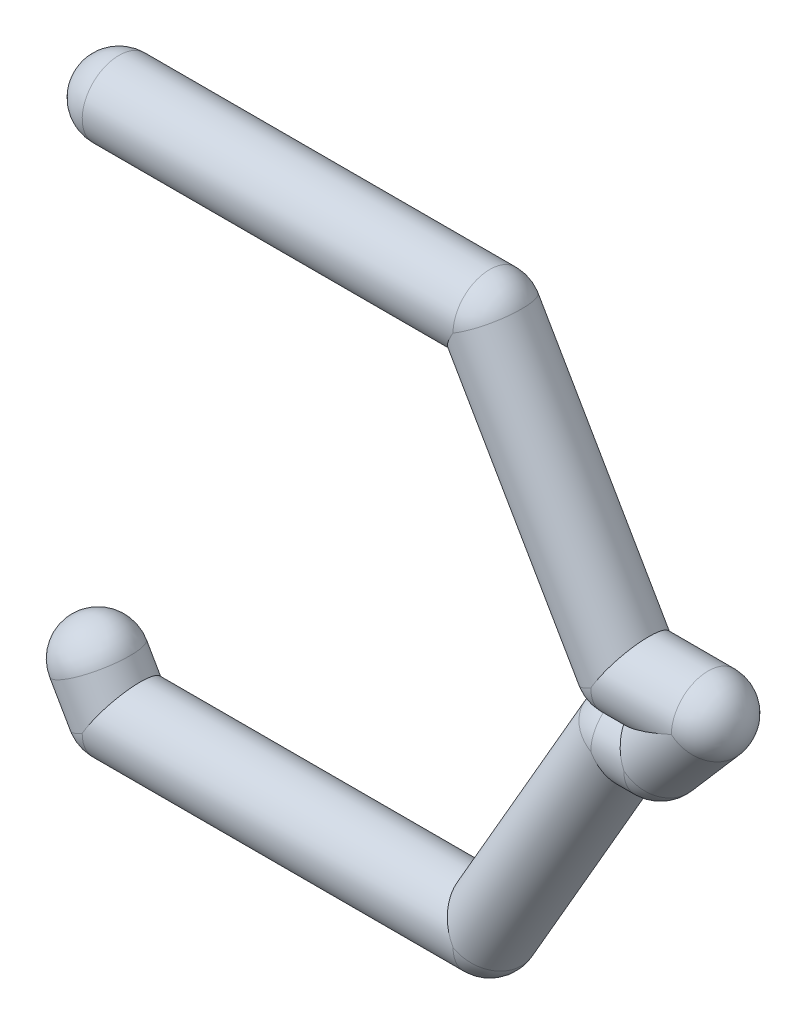
ISO-10303-21;
HEADER;
FILE_DESCRIPTION(('STEP AP214'),'2;1');
FILE_NAME('part.step','',(''),(''),'','','');
FILE_SCHEMA(('AUTOMOTIVE_DESIGN { 1 0 10303 214 1 1 1 1 }'));
ENDSEC;
DATA;
#1=APPLICATION_CONTEXT('core data for automotive mechanical design processes');
#2=APPLICATION_PROTOCOL_DEFINITION('international standard','automotive_design',2000,#1);
#3=PRODUCT_CONTEXT('',#1,'mechanical');
#4=PRODUCT('Part','Part','',(#3));
#5=PRODUCT_RELATED_PRODUCT_CATEGORY('part','',(#4));
#6=PRODUCT_DEFINITION_FORMATION('','',#4);
#7=PRODUCT_DEFINITION_CONTEXT('part definition',#1,'design');
#8=PRODUCT_DEFINITION('design','',#6,#7);
#9=PRODUCT_DEFINITION_SHAPE('','',#8);
#10=(LENGTH_UNIT() NAMED_UNIT(*) SI_UNIT(.MILLI.,.METRE.));
#11=(NAMED_UNIT(*) PLANE_ANGLE_UNIT() SI_UNIT($,.RADIAN.));
#12=(NAMED_UNIT(*) SI_UNIT($,.STERADIAN.) SOLID_ANGLE_UNIT());
#13=UNCERTAINTY_MEASURE_WITH_UNIT(LENGTH_MEASURE(1.E-05),#10,'distance_accuracy_value','');
#14=(GEOMETRIC_REPRESENTATION_CONTEXT(3) GLOBAL_UNCERTAINTY_ASSIGNED_CONTEXT((#13)) GLOBAL_UNIT_ASSIGNED_CONTEXT((#10,
#11,#12)) REPRESENTATION_CONTEXT('',''));
#15=CARTESIAN_POINT('',(0.,0.,0.));
#16=DIRECTION('',(0.,0.,1.));
#17=DIRECTION('',(1.,0.,0.));
#18=AXIS2_PLACEMENT_3D('',#15,#16,#17);
#19=CARTESIAN_POINT('',(-14.515,-13.08,1.125));
#20=DIRECTION('',(1.,0.,0.));
#21=DIRECTION('',(0.,-1.,0.));
#22=AXIS2_PLACEMENT_3D('',#19,#20,#21);
#23=SPHERICAL_SURFACE('',#22,0.24);
#24=CARTESIAN_POINT('',(-14.515,-13.08,1.125));
#25=DIRECTION('',(-0.499298623879163,0.866429964966802,0.));
#26=DIRECTION('',(-0.866429964966802,-0.499298623879163,0.));
#27=AXIS2_PLACEMENT_3D('',#24,#25,#26);
#28=CIRCLE('',#27,0.24);
#29=CARTESIAN_POINT('',(-14.515,-13.08,0.885));
#30=VERTEX_POINT('',#29);
#31=CARTESIAN_POINT('',(-14.515,-13.08,1.365));
#32=VERTEX_POINT('',#31);
#33=EDGE_CURVE('E150',#30,#32,#28,.T.);
#34=ORIENTED_EDGE('',*,*,#33,.F.);
#35=CARTESIAN_POINT('',(-14.515,-13.08,1.125));
#36=DIRECTION('',(-1.,0.,0.));
#37=DIRECTION('',(0.,0.,1.));
#38=AXIS2_PLACEMENT_3D('',#35,#36,#37);
#39=CIRCLE('',#38,0.24);
#40=EDGE_CURVE('E151',#32,#30,#39,.F.);
#41=ORIENTED_EDGE('',*,*,#40,.F.);
#42=EDGE_LOOP('',(#34,#41));
#43=FACE_BOUND('',#42,.T.);
#44=ADVANCED_FACE('F81',(#43),#23,.T.);
#45=CARTESIAN_POINT('',(-12.09,-13.08,1.125));
#46=DIRECTION('',(-1.,0.,0.));
#47=DIRECTION('',(0.,0.,1.));
#48=AXIS2_PLACEMENT_3D('',#45,#46,#47);
#49=CYLINDRICAL_SURFACE('',#48,0.24);
#50=CARTESIAN_POINT('',(-14.515,-13.08,1.125));
#51=DIRECTION('',(-0.865822910264902,0.500350565164481,0.));
#52=DIRECTION('',(-0.500350565164481,-0.865822910264902,0.));
#53=AXIS2_PLACEMENT_3D('',#50,#51,#52);
#54=ELLIPSE('',#53,0.277192942291826,0.24);
#55=EDGE_CURVE('E94',#32,#30,#54,.T.);
#56=ORIENTED_EDGE('',*,*,#55,.F.);
#57=ORIENTED_EDGE('',*,*,#40,.T.);
#58=EDGE_LOOP('',(#56,#57));
#59=FACE_BOUND('',#58,.T.);
#60=CARTESIAN_POINT('',(-12.09,-13.08,1.125));
#61=DIRECTION('',(-0.866065491045954,-0.499930560397472,0.));
#62=DIRECTION('',(-0.499930560397472,0.866065491045954,0.));
#63=AXIS2_PLACEMENT_3D('',#60,#61,#62);
#64=ELLIPSE('',#63,0.277115301881097,0.24);
#65=CARTESIAN_POINT('',(-12.09,-13.08,0.885));
#66=VERTEX_POINT('',#65);
#67=CARTESIAN_POINT('',(-12.09,-13.08,1.365));
#68=VERTEX_POINT('',#67);
#69=EDGE_CURVE('E88',#66,#68,#64,.F.);
#70=ORIENTED_EDGE('',*,*,#69,.F.);
#71=CARTESIAN_POINT('',(-12.09,-13.08,1.125));
#72=DIRECTION('',(-1.,0.,0.));
#73=DIRECTION('',(0.,0.,1.));
#74=AXIS2_PLACEMENT_3D('',#71,#72,#73);
#75=CIRCLE('',#74,0.24);
#76=EDGE_CURVE('E155',#66,#68,#75,.T.);
#77=ORIENTED_EDGE('',*,*,#76,.T.);
#78=EDGE_LOOP('',(#70,#77));
#79=FACE_BOUND('',#78,.T.);
#80=ADVANCED_FACE('F154',(#59,#79),#49,.T.);
#81=CARTESIAN_POINT('',(-12.09,-13.08,1.125));
#82=DIRECTION('',(1.,0.,0.));
#83=DIRECTION('',(0.,-1.,0.));
#84=AXIS2_PLACEMENT_3D('',#81,#82,#83);
#85=SPHERICAL_SURFACE('',#84,0.24);
#86=ORIENTED_EDGE('',*,*,#76,.F.);
#87=CARTESIAN_POINT('',(-12.09,-13.08,1.125));
#88=DIRECTION('',(-0.500138869561338,-0.865945212559032,0.));
#89=DIRECTION('',(0.865945212559032,-0.500138869561338,0.));
#90=AXIS2_PLACEMENT_3D('',#87,#88,#89);
#91=CIRCLE('',#90,0.24);
#92=EDGE_CURVE('E214',#68,#66,#91,.F.);
#93=ORIENTED_EDGE('',*,*,#92,.F.);
#94=EDGE_LOOP('',(#86,#93));
#95=FACE_BOUND('',#94,.T.);
#96=ADVANCED_FACE('F224',(#95),#85,.T.);
#97=CARTESIAN_POINT('',(-11.189,-11.52,1.125));
#98=DIRECTION('',(-0.500138869561338,-0.865945212559032,0.));
#99=DIRECTION('',(0.865945212559032,-0.500138869561338,0.));
#100=AXIS2_PLACEMENT_3D('',#97,#98,#99);
#101=CYLINDRICAL_SURFACE('',#100,0.240000000000001);
#102=CARTESIAN_POINT('',(-11.189,-11.52,1.125));
#103=DIRECTION('',(-0.866065491045954,-0.499930560397472,0.));
#104=DIRECTION('',(0.499930560397472,-0.866065491045954,0.));
#105=AXIS2_PLACEMENT_3D('',#102,#103,#104);
#106=ELLIPSE('',#105,0.277115301881097,0.24);
#107=CARTESIAN_POINT('',(-11.189,-11.52,1.365));
#108=VERTEX_POINT('',#107);
#109=CARTESIAN_POINT('',(-11.189,-11.52,0.885));
#110=VERTEX_POINT('',#109);
#111=EDGE_CURVE('E217',#108,#110,#106,.F.);
#112=ORIENTED_EDGE('',*,*,#111,.F.);
#113=CARTESIAN_POINT('',(-11.189,-11.52,1.125));
#114=DIRECTION('',(-0.500138869561336,-0.865945212559033,0.));
#115=DIRECTION('',(0.865945212559033,-0.500138869561336,0.));
#116=AXIS2_PLACEMENT_3D('',#113,#114,#115);
#117=CIRCLE('',#116,0.240000000000001);
#118=EDGE_CURVE('E212',#108,#110,#117,.T.);
#119=ORIENTED_EDGE('',*,*,#118,.T.);
#120=EDGE_LOOP('',(#112,#119));
#121=FACE_BOUND('',#120,.T.);
#122=ORIENTED_EDGE('',*,*,#92,.T.);
#123=ORIENTED_EDGE('',*,*,#69,.T.);
#124=EDGE_LOOP('',(#122,#123));
#125=FACE_BOUND('',#124,.T.);
#126=ADVANCED_FACE('F222',(#121,#125),#101,.T.);
#127=CARTESIAN_POINT('',(-11.189,-11.52,1.125));
#128=DIRECTION('',(1.,0.,0.));
#129=DIRECTION('',(0.,-1.,0.));
#130=AXIS2_PLACEMENT_3D('',#127,#128,#129);
#131=SPHERICAL_SURFACE('',#130,0.24);
#132=ORIENTED_EDGE('',*,*,#118,.F.);
#133=CARTESIAN_POINT('',(-11.189,-11.52,1.125));
#134=DIRECTION('',(-1.,0.,0.));
#135=DIRECTION('',(0.,0.,1.));
#136=AXIS2_PLACEMENT_3D('',#133,#134,#135);
#137=CIRCLE('',#136,0.24);
#138=CARTESIAN_POINT('',(-11.189,-11.34,1.28374507866388));
#139=VERTEX_POINT('',#138);
#140=EDGE_CURVE('E161',#108,#139,#137,.T.);
#141=ORIENTED_EDGE('',*,*,#140,.T.);
#142=CARTESIAN_POINT('',(-11.189,-11.34,1.125));
#143=DIRECTION('',(0.,-1.,0.));
#144=DIRECTION('',(0.,0.,-1.));
#145=AXIS2_PLACEMENT_3D('',#142,#143,#144);
#146=CIRCLE('',#145,0.158745078663876);
#147=CARTESIAN_POINT('',(-11.189,-11.34,0.966254921336124));
#148=VERTEX_POINT('',#147);
#149=EDGE_CURVE('E187',#139,#148,#146,.T.);
#150=ORIENTED_EDGE('',*,*,#149,.T.);
#151=EDGE_CURVE('E164',#148,#110,#137,.T.);
#152=ORIENTED_EDGE('',*,*,#151,.T.);
#153=EDGE_LOOP('',(#132,#141,#150,#152));
#154=FACE_BOUND('',#153,.T.);
#155=ADVANCED_FACE('F238',(#154),#131,.T.);
#156=CARTESIAN_POINT('',(-10.973,-11.52,1.125));
#157=DIRECTION('',(1.,0.,0.));
#158=DIRECTION('',(0.,-1.,0.));
#159=AXIS2_PLACEMENT_3D('',#156,#157,#158);
#160=SPHERICAL_SURFACE('',#159,0.24);
#161=CARTESIAN_POINT('',(-10.973,-11.52,1.125));
#162=DIRECTION('',(-0.65372931799024,-0.756728470985475,0.));
#163=DIRECTION('',(0.756728470985475,-0.65372931799024,0.));
#164=AXIS2_PLACEMENT_3D('',#161,#162,#163);
#165=CIRCLE('',#164,0.240000000000001);
#166=CARTESIAN_POINT('',(-10.973,-11.52,0.885));
#167=VERTEX_POINT('',#166);
#168=CARTESIAN_POINT('',(-10.973,-11.52,1.365));
#169=VERTEX_POINT('',#168);
#170=EDGE_CURVE('E176',#167,#169,#165,.T.);
#171=ORIENTED_EDGE('',*,*,#170,.T.);
#172=CARTESIAN_POINT('',(-10.973,-11.52,1.125));
#173=DIRECTION('',(-1.,0.,0.));
#174=DIRECTION('',(0.,0.,1.));
#175=AXIS2_PLACEMENT_3D('',#172,#173,#174);
#176=CIRCLE('',#175,0.24);
#177=EDGE_CURVE('E158',#167,#169,#176,.T.);
#178=ORIENTED_EDGE('',*,*,#177,.F.);
#179=EDGE_LOOP('',(#171,#178));
#180=FACE_BOUND('',#179,.T.);
#181=ADVANCED_FACE('F244',(#180),#160,.T.);
#182=CARTESIAN_POINT('',(-10.662,-11.16,1.125));
#183=DIRECTION('',(1.,0.,0.));
#184=DIRECTION('',(0.,-1.,0.));
#185=AXIS2_PLACEMENT_3D('',#182,#183,#184);
#186=SPHERICAL_SURFACE('',#185,0.24);
#187=CARTESIAN_POINT('',(-10.662,-11.16,1.125));
#188=DIRECTION('',(-0.65372931799024,-0.756728470985475,0.));
#189=DIRECTION('',(0.756728470985475,-0.65372931799024,0.));
#190=AXIS2_PLACEMENT_3D('',#187,#188,#189);
#191=CIRCLE('',#190,0.240000000000001);
#192=CARTESIAN_POINT('',(-10.662,-11.16,0.885));
#193=VERTEX_POINT('',#192);
#194=CARTESIAN_POINT('',(-10.662,-11.16,1.365));
#195=VERTEX_POINT('',#194);
#196=EDGE_CURVE('E173',#193,#195,#191,.T.);
#197=ORIENTED_EDGE('',*,*,#196,.F.);
#198=CARTESIAN_POINT('',(-10.662,-11.16,1.125));
#199=DIRECTION('',(1.,0.,0.));
#200=DIRECTION('',(0.,0.,-1.));
#201=AXIS2_PLACEMENT_3D('',#198,#199,#200);
#202=CIRCLE('',#201,0.24);
#203=EDGE_CURVE('E202',#195,#193,#202,.F.);
#204=ORIENTED_EDGE('',*,*,#203,.F.);
#205=EDGE_LOOP('',(#197,#204));
#206=FACE_BOUND('',#205,.T.);
#207=ADVANCED_FACE('F240',(#206),#186,.T.);
#208=CARTESIAN_POINT('',(-11.189,-11.16,1.125));
#209=DIRECTION('',(1.,0.,0.));
#210=DIRECTION('',(0.,0.,-1.));
#211=AXIS2_PLACEMENT_3D('',#208,#209,#210);
#212=CYLINDRICAL_SURFACE('',#211,0.24);
#213=DIRECTION('',(-1.,0.,0.));
#214=VECTOR('',#213,1.);
#215=CARTESIAN_POINT('',(-11.081,-11.34,0.966254921336124));
#216=LINE('',#215,#214);
#217=CARTESIAN_POINT('',(-11.0553660337249,-11.34,0.966254921336123));
#218=VERTEX_POINT('',#217);
#219=EDGE_CURVE('E167',#148,#218,#216,.F.);
#220=ORIENTED_EDGE('',*,*,#219,.F.);
#221=CARTESIAN_POINT('',(-11.189,-11.16,1.125));
#222=DIRECTION('',(1.,0.,0.));
#223=DIRECTION('',(0.,0.,-1.));
#224=AXIS2_PLACEMENT_3D('',#221,#222,#223);
#225=CIRCLE('',#224,0.24);
#226=CARTESIAN_POINT('',(-11.189,-11.16,0.885));
#227=VERTEX_POINT('',#226);
#228=EDGE_CURVE('E199',#148,#227,#225,.T.);
#229=ORIENTED_EDGE('',*,*,#228,.T.);
#230=CARTESIAN_POINT('',(-11.189,-11.16,1.125));
#231=DIRECTION('',(0.866065491045954,-0.499930560397472,0.));
#232=DIRECTION('',(0.499930560397472,0.866065491045954,0.));
#233=AXIS2_PLACEMENT_3D('',#230,#231,#232);
#234=ELLIPSE('',#233,0.277115301881097,0.24);
#235=CARTESIAN_POINT('',(-11.189,-11.16,1.365));
#236=VERTEX_POINT('',#235);
#237=EDGE_CURVE('E205',#236,#227,#234,.F.);
#238=ORIENTED_EDGE('',*,*,#237,.F.);
#239=EDGE_CURVE('E201',#236,#139,#225,.T.);
#240=ORIENTED_EDGE('',*,*,#239,.T.);
#241=DIRECTION('',(-1.,0.,0.));
#242=VECTOR('',#241,1.);
#243=CARTESIAN_POINT('',(-11.081,-11.34,1.28374507866388));
#244=LINE('',#243,#242);
#245=CARTESIAN_POINT('',(-11.0553660337249,-11.34,1.28374507866388));
#246=VERTEX_POINT('',#245);
#247=EDGE_CURVE('E170',#246,#139,#244,.T.);
#248=ORIENTED_EDGE('',*,*,#247,.F.);
#249=CARTESIAN_POINT('',(-10.662,-11.16,1.125));
#250=DIRECTION('',(0.416095350857088,-0.909320987877832,0.));
#251=DIRECTION('',(0.909320987877832,0.416095350857088,0.));
#252=AXIS2_PLACEMENT_3D('',#249,#250,#251);
#253=ELLIPSE('',#252,0.576790871384743,0.24);
#254=EDGE_CURVE('E181',#195,#246,#253,.T.);
#255=ORIENTED_EDGE('',*,*,#254,.F.);
#256=ORIENTED_EDGE('',*,*,#203,.T.);
#257=EDGE_CURVE('E179',#218,#193,#253,.T.);
#258=ORIENTED_EDGE('',*,*,#257,.F.);
#259=EDGE_LOOP('',(#220,#229,#238,#240,#248,#255,#256,#258));
#260=FACE_BOUND('',#259,.T.);
#261=ADVANCED_FACE('F243',(#260),#212,.T.);
#262=CARTESIAN_POINT('',(-11.189,-11.16,1.125));
#263=DIRECTION('',(1.,0.,0.));
#264=DIRECTION('',(0.,-1.,0.));
#265=AXIS2_PLACEMENT_3D('',#262,#263,#264);
#266=SPHERICAL_SURFACE('',#265,0.24);
#267=ORIENTED_EDGE('',*,*,#239,.F.);
#268=CARTESIAN_POINT('',(-11.189,-11.16,1.125));
#269=DIRECTION('',(0.500138869561338,-0.865945212559032,0.));
#270=DIRECTION('',(0.865945212559032,0.500138869561338,0.));
#271=AXIS2_PLACEMENT_3D('',#268,#269,#270);
#272=CIRCLE('',#271,0.24);
#273=EDGE_CURVE('E193',#227,#236,#272,.F.);
#274=ORIENTED_EDGE('',*,*,#273,.F.);
#275=ORIENTED_EDGE('',*,*,#228,.F.);
#276=ORIENTED_EDGE('',*,*,#149,.F.);
#277=EDGE_LOOP('',(#267,#274,#275,#276));
#278=FACE_BOUND('',#277,.T.);
#279=ADVANCED_FACE('F248',(#278),#266,.T.);
#280=CARTESIAN_POINT('',(-12.09,-9.6,1.125));
#281=DIRECTION('',(0.500138869561338,-0.865945212559032,0.));
#282=DIRECTION('',(0.865945212559032,0.500138869561338,0.));
#283=AXIS2_PLACEMENT_3D('',#280,#281,#282);
#284=CYLINDRICAL_SURFACE('',#283,0.240000000000001);
#285=CARTESIAN_POINT('',(-12.09,-9.6,1.125));
#286=DIRECTION('',(0.866065491045954,-0.499930560397472,0.));
#287=DIRECTION('',(-0.499930560397472,-0.866065491045954,0.));
#288=AXIS2_PLACEMENT_3D('',#285,#286,#287);
#289=ELLIPSE('',#288,0.277115301881097,0.24);
#290=CARTESIAN_POINT('',(-12.09,-9.6,0.885));
#291=VERTEX_POINT('',#290);
#292=CARTESIAN_POINT('',(-12.09,-9.6,1.365));
#293=VERTEX_POINT('',#292);
#294=EDGE_CURVE('E196',#291,#293,#289,.F.);
#295=ORIENTED_EDGE('',*,*,#294,.F.);
#296=CARTESIAN_POINT('',(-12.09,-9.6,1.125));
#297=DIRECTION('',(0.500138869561338,-0.865945212559032,0.));
#298=DIRECTION('',(0.865945212559032,0.500138869561338,0.));
#299=AXIS2_PLACEMENT_3D('',#296,#297,#298);
#300=CIRCLE('',#299,0.240000000000001);
#301=EDGE_CURVE('E190',#291,#293,#300,.T.);
#302=ORIENTED_EDGE('',*,*,#301,.T.);
#303=EDGE_LOOP('',(#295,#302));
#304=FACE_BOUND('',#303,.T.);
#305=ORIENTED_EDGE('',*,*,#273,.T.);
#306=ORIENTED_EDGE('',*,*,#237,.T.);
#307=EDGE_LOOP('',(#305,#306));
#308=FACE_BOUND('',#307,.T.);
#309=ADVANCED_FACE('F252',(#304,#308),#284,.T.);
#310=CARTESIAN_POINT('',(-12.09,-9.6,1.125));
#311=DIRECTION('',(1.,0.,0.));
#312=DIRECTION('',(0.,-1.,0.));
#313=AXIS2_PLACEMENT_3D('',#310,#311,#312);
#314=SPHERICAL_SURFACE('',#313,0.24);
#315=ORIENTED_EDGE('',*,*,#301,.F.);
#316=CARTESIAN_POINT('',(-12.09,-9.6,1.125));
#317=DIRECTION('',(1.,0.,0.));
#318=DIRECTION('',(0.,0.,-1.));
#319=AXIS2_PLACEMENT_3D('',#316,#317,#318);
#320=CIRCLE('',#319,0.24);
#321=EDGE_CURVE('E185',#291,#293,#320,.T.);
#322=ORIENTED_EDGE('',*,*,#321,.T.);
#323=EDGE_LOOP('',(#315,#322));
#324=FACE_BOUND('',#323,.T.);
#325=ADVANCED_FACE('F256',(#324),#314,.T.);
#326=CARTESIAN_POINT('',(-14.515,-9.6,1.125));
#327=DIRECTION('',(1.,0.,0.));
#328=DIRECTION('',(0.,0.,-1.));
#329=AXIS2_PLACEMENT_3D('',#326,#327,#328);
#330=CYLINDRICAL_SURFACE('',#329,0.24);
#331=ORIENTED_EDGE('',*,*,#321,.F.);
#332=ORIENTED_EDGE('',*,*,#294,.T.);
#333=EDGE_LOOP('',(#331,#332));
#334=FACE_BOUND('',#333,.T.);
#335=CARTESIAN_POINT('',(-14.515,-9.6,1.125));
#336=DIRECTION('',(1.,0.,0.));
#337=DIRECTION('',(0.,0.,-1.));
#338=AXIS2_PLACEMENT_3D('',#335,#336,#337);
#339=CIRCLE('',#338,0.24);
#340=CARTESIAN_POINT('',(-14.515,-9.6,0.885));
#341=VERTEX_POINT('',#340);
#342=EDGE_CURVE('E182',#341,#341,#339,.T.);
#343=ORIENTED_EDGE('',*,*,#342,.T.);
#344=EDGE_LOOP('',(#343));
#345=FACE_BOUND('',#344,.T.);
#346=ADVANCED_FACE('F268',(#334,#345),#330,.T.);
#347=CARTESIAN_POINT('',(-14.515,-9.6,1.125));
#348=DIRECTION('',(1.,0.,0.));
#349=DIRECTION('',(0.,-1.,0.));
#350=AXIS2_PLACEMENT_3D('',#347,#348,#349);
#351=SPHERICAL_SURFACE('',#350,0.24);
#352=ORIENTED_EDGE('',*,*,#342,.F.);
#353=EDGE_LOOP('',(#352));
#354=FACE_BOUND('',#353,.T.);
#355=ADVANCED_FACE('F264',(#354),#351,.T.);
#356=CARTESIAN_POINT('',(-10.662,-11.16,1.125));
#357=DIRECTION('',(-0.653729317990234,-0.756728470985481,0.));
#358=DIRECTION('',(0.756728470985481,-0.653729317990234,0.));
#359=AXIS2_PLACEMENT_3D('',#356,#357,#358);
#360=CYLINDRICAL_SURFACE('',#359,0.240000000000001);
#361=CARTESIAN_POINT('',(-10.973,-11.52,1.125));
#362=DIRECTION('',(-0.909320987877832,-0.416095350857088,0.));
#363=DIRECTION('',(0.416095350857088,-0.909320987877832,0.));
#364=AXIS2_PLACEMENT_3D('',#361,#362,#363);
#365=ELLIPSE('',#364,0.263933202025954,0.24);
#366=EDGE_CURVE('E211',#169,#246,#365,.T.);
#367=ORIENTED_EDGE('',*,*,#366,.F.);
#368=ORIENTED_EDGE('',*,*,#170,.F.);
#369=EDGE_CURVE('E208',#218,#167,#365,.T.);
#370=ORIENTED_EDGE('',*,*,#369,.F.);
#371=ORIENTED_EDGE('',*,*,#257,.T.);
#372=ORIENTED_EDGE('',*,*,#196,.T.);
#373=ORIENTED_EDGE('',*,*,#254,.T.);
#374=EDGE_LOOP('',(#367,#368,#370,#371,#372,#373));
#375=FACE_BOUND('',#374,.T.);
#376=ADVANCED_FACE('F267',(#375),#360,.T.);
#377=CARTESIAN_POINT('',(-10.973,-11.52,1.125));
#378=DIRECTION('',(-1.,0.,0.));
#379=DIRECTION('',(0.,0.,1.));
#380=AXIS2_PLACEMENT_3D('',#377,#378,#379);
#381=CYLINDRICAL_SURFACE('',#380,0.24);
#382=ORIENTED_EDGE('',*,*,#140,.F.);
#383=ORIENTED_EDGE('',*,*,#111,.T.);
#384=ORIENTED_EDGE('',*,*,#151,.F.);
#385=ORIENTED_EDGE('',*,*,#219,.T.);
#386=ORIENTED_EDGE('',*,*,#369,.T.);
#387=ORIENTED_EDGE('',*,*,#177,.T.);
#388=ORIENTED_EDGE('',*,*,#366,.T.);
#389=ORIENTED_EDGE('',*,*,#247,.T.);
#390=EDGE_LOOP('',(#382,#383,#384,#385,#386,#387,#388,#389));
#391=FACE_BOUND('',#390,.T.);
#392=ADVANCED_FACE('F278',(#391),#381,.T.);
#393=CARTESIAN_POINT('',(-14.515,-13.08,1.125));
#394=DIRECTION('',(-0.499298623879168,0.866429964966799,0.));
#395=DIRECTION('',(-0.866429964966799,-0.499298623879168,0.));
#396=AXIS2_PLACEMENT_3D('',#393,#394,#395);
#397=CYLINDRICAL_SURFACE('',#396,0.24);
#398=CARTESIAN_POINT('',(-14.651,-12.844,1.125));
#399=DIRECTION('',(-0.499298623879168,0.866429964966799,0.));
#400=DIRECTION('',(-0.866429964966799,-0.499298623879168,0.));
#401=AXIS2_PLACEMENT_3D('',#398,#399,#400);
#402=CIRCLE('',#401,0.24);
#403=CARTESIAN_POINT('',(-14.858943191592,-12.963831669731,1.125));
#404=VERTEX_POINT('',#403);
#405=EDGE_CURVE('E12',#404,#404,#402,.F.);
#406=ORIENTED_EDGE('',*,*,#405,.T.);
#407=EDGE_LOOP('',(#406));
#408=FACE_BOUND('',#407,.T.);
#409=ORIENTED_EDGE('',*,*,#33,.T.);
#410=ORIENTED_EDGE('',*,*,#55,.T.);
#411=EDGE_LOOP('',(#409,#410));
#412=FACE_BOUND('',#411,.T.);
#413=ADVANCED_FACE('F157',(#408,#412),#397,.T.);
#414=CARTESIAN_POINT('',(-14.651,-12.844,1.125));
#415=DIRECTION('',(1.,0.,0.));
#416=DIRECTION('',(0.,-1.,0.));
#417=AXIS2_PLACEMENT_3D('',#414,#415,#416);
#418=SPHERICAL_SURFACE('',#417,0.24);
#419=CARTESIAN_POINT('',(-14.651,-12.844,1.125));
#420=DIRECTION('',(-0.499298623879168,0.866429964966799,0.));
#421=DIRECTION('',(-0.866429964966799,-0.499298623879168,0.));
#422=AXIS2_PLACEMENT_3D('',#419,#420,#421);
#423=SPHERICAL_SURFACE('',#422,0.24);
#424=ORIENTED_EDGE('',*,*,#405,.F.);
#425=EDGE_LOOP('',(#424));
#426=FACE_BOUND('',#425,.T.);
#427=ADVANCED_FACE('F232',(#426),#423,.T.);
#428=CLOSED_SHELL('',(#44,#80,#96,#126,#155,#181,#207,#261,#279,#309,#325,#346,#355,#376,#392,
#413,#427));
#429=MANIFOLD_SOLID_BREP('B2',#428);
#430=ADVANCED_BREP_SHAPE_REPRESENTATION('',(#18,#429),#14);
#431=SHAPE_DEFINITION_REPRESENTATION(#9,#430);
ENDSEC;
END-ISO-10303-21;
